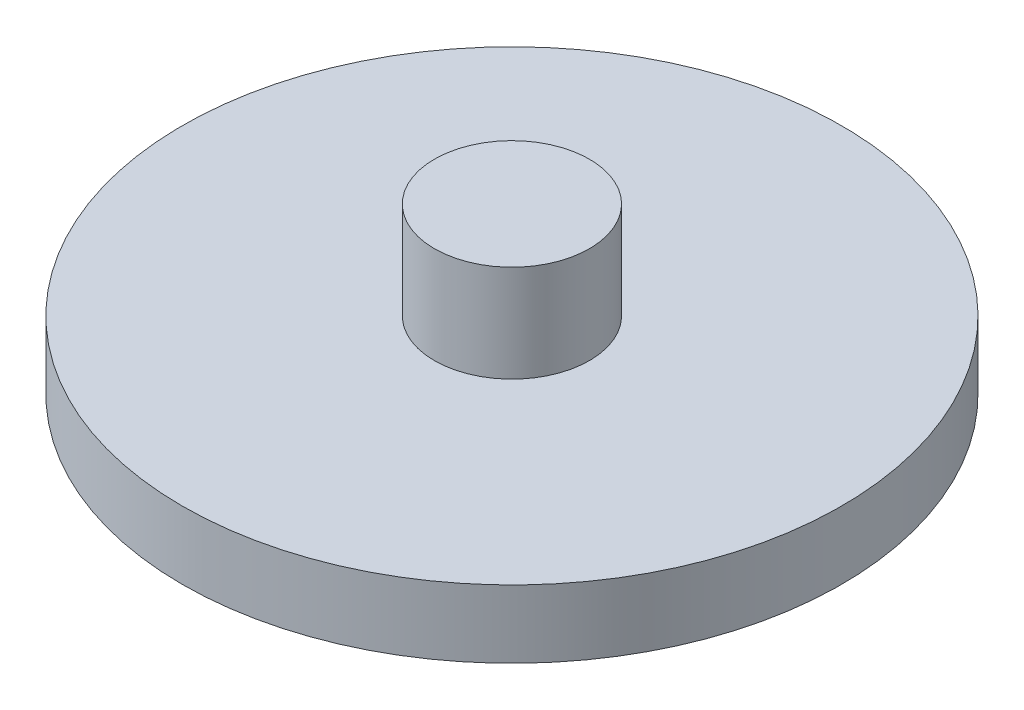
ISO-10303-21;
HEADER;
FILE_DESCRIPTION(('STEP AP214'),'2;1');
FILE_NAME('part.step','',(''),(''),'','','');
FILE_SCHEMA(('AUTOMOTIVE_DESIGN { 1 0 10303 214 1 1 1 1 }'));
ENDSEC;
DATA;
#1=APPLICATION_CONTEXT('core data for automotive mechanical design processes');
#2=APPLICATION_PROTOCOL_DEFINITION('international standard','automotive_design',2000,#1);
#3=PRODUCT_CONTEXT('',#1,'mechanical');
#4=PRODUCT('Part','Part','',(#3));
#5=PRODUCT_RELATED_PRODUCT_CATEGORY('part','',(#4));
#6=PRODUCT_DEFINITION_FORMATION('','',#4);
#7=PRODUCT_DEFINITION_CONTEXT('part definition',#1,'design');
#8=PRODUCT_DEFINITION('design','',#6,#7);
#9=PRODUCT_DEFINITION_SHAPE('','',#8);
#10=(LENGTH_UNIT() NAMED_UNIT(*) SI_UNIT(.MILLI.,.METRE.));
#11=(NAMED_UNIT(*) PLANE_ANGLE_UNIT() SI_UNIT($,.RADIAN.));
#12=(NAMED_UNIT(*) SI_UNIT($,.STERADIAN.) SOLID_ANGLE_UNIT());
#13=UNCERTAINTY_MEASURE_WITH_UNIT(LENGTH_MEASURE(1.E-05),#10,'distance_accuracy_value','');
#14=(GEOMETRIC_REPRESENTATION_CONTEXT(3) GLOBAL_UNCERTAINTY_ASSIGNED_CONTEXT((#13)) GLOBAL_UNIT_ASSIGNED_CONTEXT((#10,
#11,#12)) REPRESENTATION_CONTEXT('',''));
#15=CARTESIAN_POINT('',(0.,0.,0.));
#16=DIRECTION('',(0.,0.,1.));
#17=DIRECTION('',(1.,0.,0.));
#18=AXIS2_PLACEMENT_3D('',#15,#16,#17);
#19=CARTESIAN_POINT('',(0.,7.,0.));
#20=DIRECTION('',(0.,-1.,0.));
#21=DIRECTION('',(0.,0.,-1.));
#22=AXIS2_PLACEMENT_3D('',#19,#20,#21);
#23=CYLINDRICAL_SURFACE('',#22,34.);
#24=CARTESIAN_POINT('',(0.,7.,0.));
#25=DIRECTION('',(0.,1.,0.));
#26=DIRECTION('',(0.,0.,1.));
#27=AXIS2_PLACEMENT_3D('',#24,#25,#26);
#28=CIRCLE('',#27,34.);
#29=CARTESIAN_POINT('',(0.,7.,34.));
#30=VERTEX_POINT('',#29);
#31=EDGE_CURVE('E40',#30,#30,#28,.T.);
#32=ORIENTED_EDGE('',*,*,#31,.F.);
#33=EDGE_LOOP('',(#32));
#34=FACE_BOUND('',#33,.T.);
#35=CARTESIAN_POINT('',(0.,0.,0.));
#36=DIRECTION('',(0.,1.,0.));
#37=DIRECTION('',(0.,0.,1.));
#38=AXIS2_PLACEMENT_3D('',#35,#36,#37);
#39=CIRCLE('',#38,34.);
#40=CARTESIAN_POINT('',(0.,0.,34.));
#41=VERTEX_POINT('',#40);
#42=EDGE_CURVE('E36',#41,#41,#39,.T.);
#43=ORIENTED_EDGE('',*,*,#42,.T.);
#44=EDGE_LOOP('',(#43));
#45=FACE_BOUND('',#44,.T.);
#46=ADVANCED_FACE('F33',(#34,#45),#23,.T.);
#47=CARTESIAN_POINT('',(0.,7.,0.));
#48=DIRECTION('',(0.,1.,0.));
#49=DIRECTION('',(0.,0.,1.));
#50=AXIS2_PLACEMENT_3D('',#47,#48,#49);
#51=PLANE('',#50);
#52=CARTESIAN_POINT('',(0.,7.,0.));
#53=DIRECTION('',(0.,1.,0.));
#54=DIRECTION('',(0.,0.,1.));
#55=AXIS2_PLACEMENT_3D('',#52,#53,#54);
#56=CIRCLE('',#55,8.);
#57=CARTESIAN_POINT('',(0.,7.,8.));
#58=VERTEX_POINT('',#57);
#59=EDGE_CURVE('E10',#58,#58,#56,.T.);
#60=ORIENTED_EDGE('',*,*,#59,.F.);
#61=EDGE_LOOP('',(#60));
#62=FACE_BOUND('',#61,.T.);
#63=ORIENTED_EDGE('',*,*,#31,.T.);
#64=EDGE_LOOP('',(#63));
#65=FACE_BOUND('',#64,.T.);
#66=ADVANCED_FACE('F57',(#62,#65),#51,.T.);
#67=CARTESIAN_POINT('',(0.,0.,0.));
#68=DIRECTION('',(0.,1.,0.));
#69=DIRECTION('',(0.,0.,1.));
#70=AXIS2_PLACEMENT_3D('',#67,#68,#69);
#71=PLANE('',#70);
#72=ORIENTED_EDGE('',*,*,#42,.F.);
#73=EDGE_LOOP('',(#72));
#74=FACE_BOUND('',#73,.T.);
#75=ADVANCED_FACE('F54',(#74),#71,.F.);
#76=CARTESIAN_POINT('',(0.,17.,0.));
#77=DIRECTION('',(0.,-1.,0.));
#78=DIRECTION('',(0.,0.,-1.));
#79=AXIS2_PLACEMENT_3D('',#76,#77,#78);
#80=CYLINDRICAL_SURFACE('',#79,8.);
#81=CARTESIAN_POINT('',(0.,17.,0.));
#82=DIRECTION('',(0.,1.,0.));
#83=DIRECTION('',(0.,0.,1.));
#84=AXIS2_PLACEMENT_3D('',#81,#82,#83);
#85=CIRCLE('',#84,8.);
#86=CARTESIAN_POINT('',(0.,17.,8.));
#87=VERTEX_POINT('',#86);
#88=EDGE_CURVE('E46',#87,#87,#85,.T.);
#89=ORIENTED_EDGE('',*,*,#88,.F.);
#90=EDGE_LOOP('',(#89));
#91=FACE_BOUND('',#90,.T.);
#92=ORIENTED_EDGE('',*,*,#59,.T.);
#93=EDGE_LOOP('',(#92));
#94=FACE_BOUND('',#93,.T.);
#95=ADVANCED_FACE('F56',(#91,#94),#80,.T.);
#96=CARTESIAN_POINT('',(0.,17.,0.));
#97=DIRECTION('',(0.,1.,0.));
#98=DIRECTION('',(0.,0.,1.));
#99=AXIS2_PLACEMENT_3D('',#96,#97,#98);
#100=PLANE('',#99);
#101=ORIENTED_EDGE('',*,*,#88,.T.);
#102=EDGE_LOOP('',(#101));
#103=FACE_BOUND('',#102,.T.);
#104=ADVANCED_FACE('F62',(#103),#100,.T.);
#105=CLOSED_SHELL('',(#46,#66,#75,#95,#104));
#106=MANIFOLD_SOLID_BREP('B2',#105);
#107=ADVANCED_BREP_SHAPE_REPRESENTATION('',(#18,#106),#14);
#108=SHAPE_DEFINITION_REPRESENTATION(#9,#107);
ENDSEC;
END-ISO-10303-21;
